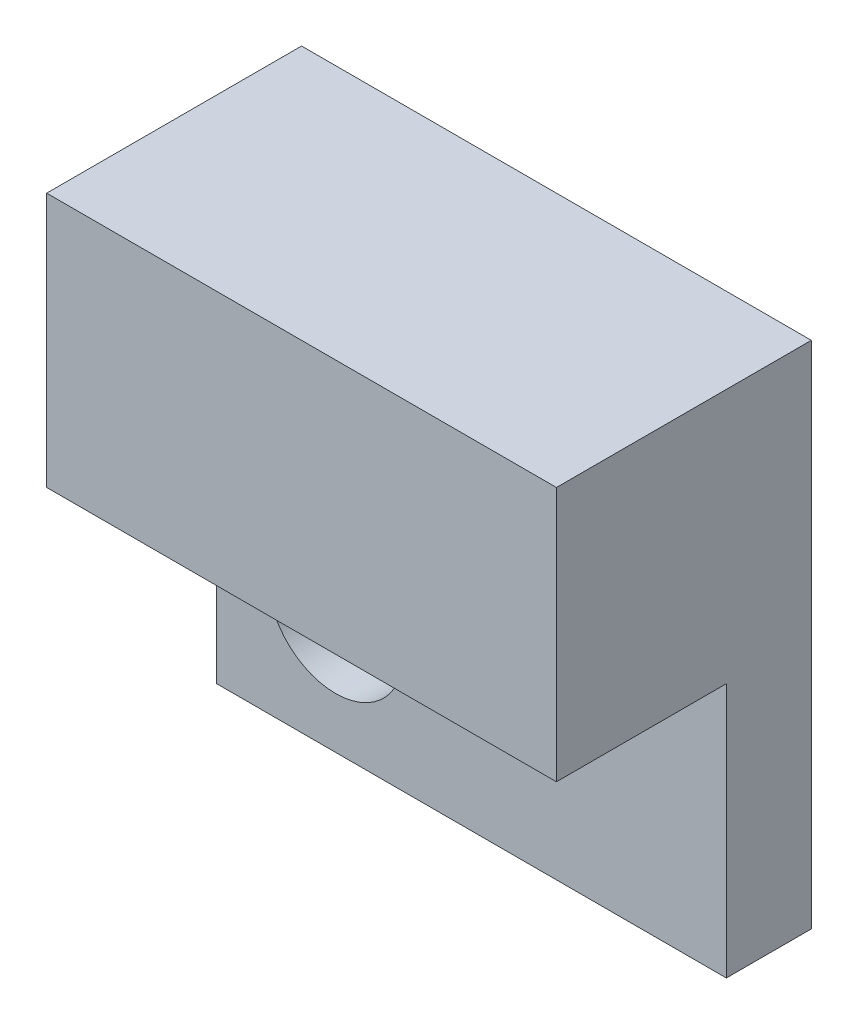
ISO-10303-21;
HEADER;
FILE_DESCRIPTION(('STEP AP214'),'2;1');
FILE_NAME('part.step','',(''),(''),'','','');
FILE_SCHEMA(('AUTOMOTIVE_DESIGN { 1 0 10303 214 1 1 1 1 }'));
ENDSEC;
DATA;
#1=APPLICATION_CONTEXT('core data for automotive mechanical design processes');
#2=APPLICATION_PROTOCOL_DEFINITION('international standard','automotive_design',2000,#1);
#3=PRODUCT_CONTEXT('',#1,'mechanical');
#4=PRODUCT('Part','Part','',(#3));
#5=PRODUCT_RELATED_PRODUCT_CATEGORY('part','',(#4));
#6=PRODUCT_DEFINITION_FORMATION('','',#4);
#7=PRODUCT_DEFINITION_CONTEXT('part definition',#1,'design');
#8=PRODUCT_DEFINITION('design','',#6,#7);
#9=PRODUCT_DEFINITION_SHAPE('','',#8);
#10=(LENGTH_UNIT() NAMED_UNIT(*) SI_UNIT(.MILLI.,.METRE.));
#11=(NAMED_UNIT(*) PLANE_ANGLE_UNIT() SI_UNIT($,.RADIAN.));
#12=(NAMED_UNIT(*) SI_UNIT($,.STERADIAN.) SOLID_ANGLE_UNIT());
#13=UNCERTAINTY_MEASURE_WITH_UNIT(LENGTH_MEASURE(1.E-05),#10,'distance_accuracy_value','');
#14=(GEOMETRIC_REPRESENTATION_CONTEXT(3) GLOBAL_UNCERTAINTY_ASSIGNED_CONTEXT((#13)) GLOBAL_UNIT_ASSIGNED_CONTEXT((#10,
#11,#12)) REPRESENTATION_CONTEXT('',''));
#15=CARTESIAN_POINT('',(0.,0.,0.));
#16=DIRECTION('',(0.,0.,1.));
#17=DIRECTION('',(1.,0.,0.));
#18=AXIS2_PLACEMENT_3D('',#15,#16,#17);
#19=CARTESIAN_POINT('',(0.,0.,15.));
#20=DIRECTION('',(1.,0.,0.));
#21=DIRECTION('',(0.,0.,-1.));
#22=AXIS2_PLACEMENT_3D('',#19,#20,#21);
#23=PLANE('',#22);
#24=DIRECTION('',(0.,0.,-1.));
#25=VECTOR('',#24,1.);
#26=CARTESIAN_POINT('',(0.,0.,15.));
#27=LINE('',#26,#25);
#28=CARTESIAN_POINT('',(0.,0.,5.));
#29=VERTEX_POINT('',#28);
#30=CARTESIAN_POINT('',(0.,0.,0.));
#31=VERTEX_POINT('',#30);
#32=EDGE_CURVE('E11',#29,#31,#27,.T.);
#33=ORIENTED_EDGE('',*,*,#32,.F.);
#34=DIRECTION('',(0.,-1.,0.));
#35=VECTOR('',#34,1.);
#36=CARTESIAN_POINT('',(0.,0.,5.));
#37=LINE('',#36,#35);
#38=CARTESIAN_POINT('',(0.,15.,5.));
#39=VERTEX_POINT('',#38);
#40=EDGE_CURVE('E123',#39,#29,#37,.T.);
#41=ORIENTED_EDGE('',*,*,#40,.F.);
#42=DIRECTION('',(0.,0.,-1.));
#43=VECTOR('',#42,1.);
#44=CARTESIAN_POINT('',(0.,15.,15.));
#45=LINE('',#44,#43);
#46=CARTESIAN_POINT('',(0.,15.,15.));
#47=VERTEX_POINT('',#46);
#48=EDGE_CURVE('E148',#47,#39,#45,.T.);
#49=ORIENTED_EDGE('',*,*,#48,.F.);
#50=DIRECTION('',(0.,-1.,0.));
#51=VECTOR('',#50,1.);
#52=CARTESIAN_POINT('',(0.,0.,15.));
#53=LINE('',#52,#51);
#54=CARTESIAN_POINT('',(0.,30.,15.));
#55=VERTEX_POINT('',#54);
#56=EDGE_CURVE('E85',#55,#47,#53,.T.);
#57=ORIENTED_EDGE('',*,*,#56,.F.);
#58=DIRECTION('',(0.,0.,-1.));
#59=VECTOR('',#58,1.);
#60=CARTESIAN_POINT('',(0.,30.,15.));
#61=LINE('',#60,#59);
#62=CARTESIAN_POINT('',(0.,30.,0.));
#63=VERTEX_POINT('',#62);
#64=EDGE_CURVE('E78',#55,#63,#61,.T.);
#65=ORIENTED_EDGE('',*,*,#64,.T.);
#66=DIRECTION('',(0.,-1.,0.));
#67=VECTOR('',#66,1.);
#68=CARTESIAN_POINT('',(0.,0.,0.));
#69=LINE('',#68,#67);
#70=EDGE_CURVE('E91',#63,#31,#69,.T.);
#71=ORIENTED_EDGE('',*,*,#70,.T.);
#72=EDGE_LOOP('',(#33,#41,#49,#57,#65,#71));
#73=FACE_BOUND('',#72,.T.);
#74=ADVANCED_FACE('F33',(#73),#23,.F.);
#75=CARTESIAN_POINT('',(0.,0.,15.));
#76=DIRECTION('',(0.,1.,0.));
#77=DIRECTION('',(0.,0.,1.));
#78=AXIS2_PLACEMENT_3D('',#75,#76,#77);
#79=PLANE('',#78);
#80=DIRECTION('',(0.,0.,-1.));
#81=VECTOR('',#80,1.);
#82=CARTESIAN_POINT('',(30.,0.,15.));
#83=LINE('',#82,#81);
#84=CARTESIAN_POINT('',(30.,0.,5.));
#85=VERTEX_POINT('',#84);
#86=CARTESIAN_POINT('',(30.,0.,0.));
#87=VERTEX_POINT('',#86);
#88=EDGE_CURVE('E41',#85,#87,#83,.T.);
#89=ORIENTED_EDGE('',*,*,#88,.F.);
#90=DIRECTION('',(-1.,0.,0.));
#91=VECTOR('',#90,1.);
#92=CARTESIAN_POINT('',(30.,0.,5.));
#93=LINE('',#92,#91);
#94=EDGE_CURVE('E119',#85,#29,#93,.T.);
#95=ORIENTED_EDGE('',*,*,#94,.T.);
#96=ORIENTED_EDGE('',*,*,#32,.T.);
#97=DIRECTION('',(1.,0.,0.));
#98=VECTOR('',#97,1.);
#99=CARTESIAN_POINT('',(0.,0.,0.));
#100=LINE('',#99,#98);
#101=EDGE_CURVE('E97',#31,#87,#100,.T.);
#102=ORIENTED_EDGE('',*,*,#101,.T.);
#103=EDGE_LOOP('',(#89,#95,#96,#102));
#104=FACE_BOUND('',#103,.T.);
#105=ADVANCED_FACE('F116',(#104),#79,.F.);
#106=CARTESIAN_POINT('',(30.,0.,15.));
#107=DIRECTION('',(-1.,0.,0.));
#108=DIRECTION('',(0.,0.,1.));
#109=AXIS2_PLACEMENT_3D('',#106,#107,#108);
#110=PLANE('',#109);
#111=DIRECTION('',(0.,0.,-1.));
#112=VECTOR('',#111,1.);
#113=CARTESIAN_POINT('',(30.,15.,15.));
#114=LINE('',#113,#112);
#115=CARTESIAN_POINT('',(30.,15.,15.));
#116=VERTEX_POINT('',#115);
#117=CARTESIAN_POINT('',(30.,15.,5.));
#118=VERTEX_POINT('',#117);
#119=EDGE_CURVE('E48',#116,#118,#114,.T.);
#120=ORIENTED_EDGE('',*,*,#119,.T.);
#121=DIRECTION('',(0.,-1.,0.));
#122=VECTOR('',#121,1.);
#123=CARTESIAN_POINT('',(30.,0.,5.));
#124=LINE('',#123,#122);
#125=EDGE_CURVE('E113',#118,#85,#124,.T.);
#126=ORIENTED_EDGE('',*,*,#125,.T.);
#127=ORIENTED_EDGE('',*,*,#88,.T.);
#128=DIRECTION('',(0.,1.,0.));
#129=VECTOR('',#128,1.);
#130=CARTESIAN_POINT('',(30.,0.,0.));
#131=LINE('',#130,#129);
#132=CARTESIAN_POINT('',(30.,30.,0.));
#133=VERTEX_POINT('',#132);
#134=EDGE_CURVE('E86',#87,#133,#131,.T.);
#135=ORIENTED_EDGE('',*,*,#134,.T.);
#136=DIRECTION('',(0.,0.,-1.));
#137=VECTOR('',#136,1.);
#138=CARTESIAN_POINT('',(30.,30.,15.));
#139=LINE('',#138,#137);
#140=CARTESIAN_POINT('',(30.,30.,15.));
#141=VERTEX_POINT('',#140);
#142=EDGE_CURVE('E81',#141,#133,#139,.T.);
#143=ORIENTED_EDGE('',*,*,#142,.F.);
#144=DIRECTION('',(0.,1.,0.));
#145=VECTOR('',#144,1.);
#146=CARTESIAN_POINT('',(30.,0.,15.));
#147=LINE('',#146,#145);
#148=EDGE_CURVE('E143',#116,#141,#147,.T.);
#149=ORIENTED_EDGE('',*,*,#148,.F.);
#150=EDGE_LOOP('',(#120,#126,#127,#135,#143,#149));
#151=FACE_BOUND('',#150,.T.);
#152=ADVANCED_FACE('F111',(#151),#110,.F.);
#153=CARTESIAN_POINT('',(0.,30.,15.));
#154=DIRECTION('',(0.,-1.,0.));
#155=DIRECTION('',(0.,0.,-1.));
#156=AXIS2_PLACEMENT_3D('',#153,#154,#155);
#157=PLANE('',#156);
#158=DIRECTION('',(-1.,0.,0.));
#159=VECTOR('',#158,1.);
#160=CARTESIAN_POINT('',(0.,30.,0.));
#161=LINE('',#160,#159);
#162=EDGE_CURVE('E75',#133,#63,#161,.T.);
#163=ORIENTED_EDGE('',*,*,#162,.T.);
#164=ORIENTED_EDGE('',*,*,#64,.F.);
#165=DIRECTION('',(-1.,0.,0.));
#166=VECTOR('',#165,1.);
#167=CARTESIAN_POINT('',(0.,30.,15.));
#168=LINE('',#167,#166);
#169=EDGE_CURVE('E57',#141,#55,#168,.T.);
#170=ORIENTED_EDGE('',*,*,#169,.F.);
#171=ORIENTED_EDGE('',*,*,#142,.T.);
#172=EDGE_LOOP('',(#163,#164,#170,#171));
#173=FACE_BOUND('',#172,.T.);
#174=ADVANCED_FACE('F77',(#173),#157,.F.);
#175=CARTESIAN_POINT('',(0.,30.,15.));
#176=DIRECTION('',(0.,0.,-1.));
#177=DIRECTION('',(-1.,0.,0.));
#178=AXIS2_PLACEMENT_3D('',#175,#176,#177);
#179=PLANE('',#178);
#180=ORIENTED_EDGE('',*,*,#56,.T.);
#181=DIRECTION('',(-1.,0.,0.));
#182=VECTOR('',#181,1.);
#183=CARTESIAN_POINT('',(30.,15.,15.));
#184=LINE('',#183,#182);
#185=EDGE_CURVE('E137',#116,#47,#184,.T.);
#186=ORIENTED_EDGE('',*,*,#185,.F.);
#187=ORIENTED_EDGE('',*,*,#148,.T.);
#188=ORIENTED_EDGE('',*,*,#169,.T.);
#189=EDGE_LOOP('',(#180,#186,#187,#188));
#190=FACE_BOUND('',#189,.T.);
#191=ADVANCED_FACE('F145',(#190),#179,.F.);
#192=CARTESIAN_POINT('',(0.,30.,0.));
#193=DIRECTION('',(0.,0.,-1.));
#194=DIRECTION('',(-1.,0.,0.));
#195=AXIS2_PLACEMENT_3D('',#192,#193,#194);
#196=PLANE('',#195);
#197=CARTESIAN_POINT('',(7.,7.,0.));
#198=DIRECTION('',(0.,0.,1.));
#199=DIRECTION('',(1.,0.,0.));
#200=AXIS2_PLACEMENT_3D('',#197,#198,#199);
#201=CIRCLE('',#200,4.);
#202=CARTESIAN_POINT('',(11.,7.,0.));
#203=VERTEX_POINT('',#202);
#204=EDGE_CURVE('E98',#203,#203,#201,.T.);
#205=ORIENTED_EDGE('',*,*,#204,.T.);
#206=EDGE_LOOP('',(#205));
#207=FACE_BOUND('',#206,.T.);
#208=ORIENTED_EDGE('',*,*,#70,.F.);
#209=ORIENTED_EDGE('',*,*,#162,.F.);
#210=ORIENTED_EDGE('',*,*,#134,.F.);
#211=ORIENTED_EDGE('',*,*,#101,.F.);
#212=EDGE_LOOP('',(#208,#209,#210,#211));
#213=FACE_BOUND('',#212,.T.);
#214=ADVANCED_FACE('F95',(#207,#213),#196,.T.);
#215=CARTESIAN_POINT('',(7.,7.,0.));
#216=DIRECTION('',(0.,0.,1.));
#217=DIRECTION('',(1.,0.,0.));
#218=AXIS2_PLACEMENT_3D('',#215,#216,#217);
#219=CYLINDRICAL_SURFACE('',#218,4.);
#220=CARTESIAN_POINT('',(7.,7.,5.));
#221=DIRECTION('',(0.,0.,-1.));
#222=DIRECTION('',(-1.,0.,0.));
#223=AXIS2_PLACEMENT_3D('',#220,#221,#222);
#224=CIRCLE('',#223,4.);
#225=CARTESIAN_POINT('',(3.,7.,5.));
#226=VERTEX_POINT('',#225);
#227=EDGE_CURVE('E36',#226,#226,#224,.F.);
#228=ORIENTED_EDGE('',*,*,#227,.T.);
#229=EDGE_LOOP('',(#228));
#230=FACE_BOUND('',#229,.T.);
#231=ORIENTED_EDGE('',*,*,#204,.F.);
#232=EDGE_LOOP('',(#231));
#233=FACE_BOUND('',#232,.T.);
#234=ADVANCED_FACE('F156',(#230,#233),#219,.F.);
#235=CARTESIAN_POINT('',(30.,0.,5.));
#236=DIRECTION('',(0.,0.,-1.));
#237=DIRECTION('',(-1.,0.,0.));
#238=AXIS2_PLACEMENT_3D('',#235,#236,#237);
#239=PLANE('',#238);
#240=ORIENTED_EDGE('',*,*,#40,.T.);
#241=ORIENTED_EDGE('',*,*,#94,.F.);
#242=ORIENTED_EDGE('',*,*,#125,.F.);
#243=DIRECTION('',(-1.,0.,0.));
#244=VECTOR('',#243,1.);
#245=CARTESIAN_POINT('',(30.,15.,5.));
#246=LINE('',#245,#244);
#247=EDGE_CURVE('E134',#118,#39,#246,.T.);
#248=ORIENTED_EDGE('',*,*,#247,.T.);
#249=EDGE_LOOP('',(#240,#241,#242,#248));
#250=FACE_BOUND('',#249,.T.);
#251=ORIENTED_EDGE('',*,*,#227,.F.);
#252=EDGE_LOOP('',(#251));
#253=FACE_BOUND('',#252,.T.);
#254=ADVANCED_FACE('F132',(#250,#253),#239,.F.);
#255=CARTESIAN_POINT('',(30.,15.,15.));
#256=DIRECTION('',(0.,1.,0.));
#257=DIRECTION('',(0.,0.,1.));
#258=AXIS2_PLACEMENT_3D('',#255,#256,#257);
#259=PLANE('',#258);
#260=ORIENTED_EDGE('',*,*,#48,.T.);
#261=ORIENTED_EDGE('',*,*,#247,.F.);
#262=ORIENTED_EDGE('',*,*,#119,.F.);
#263=ORIENTED_EDGE('',*,*,#185,.T.);
#264=EDGE_LOOP('',(#260,#261,#262,#263));
#265=FACE_BOUND('',#264,.T.);
#266=ADVANCED_FACE('F150',(#265),#259,.F.);
#267=CLOSED_SHELL('',(#74,#105,#152,#174,#191,#214,#234,#254,#266));
#268=MANIFOLD_SOLID_BREP('B2',#267);
#269=ADVANCED_BREP_SHAPE_REPRESENTATION('',(#18,#268),#14);
#270=SHAPE_DEFINITION_REPRESENTATION(#9,#269);
ENDSEC;
END-ISO-10303-21;
